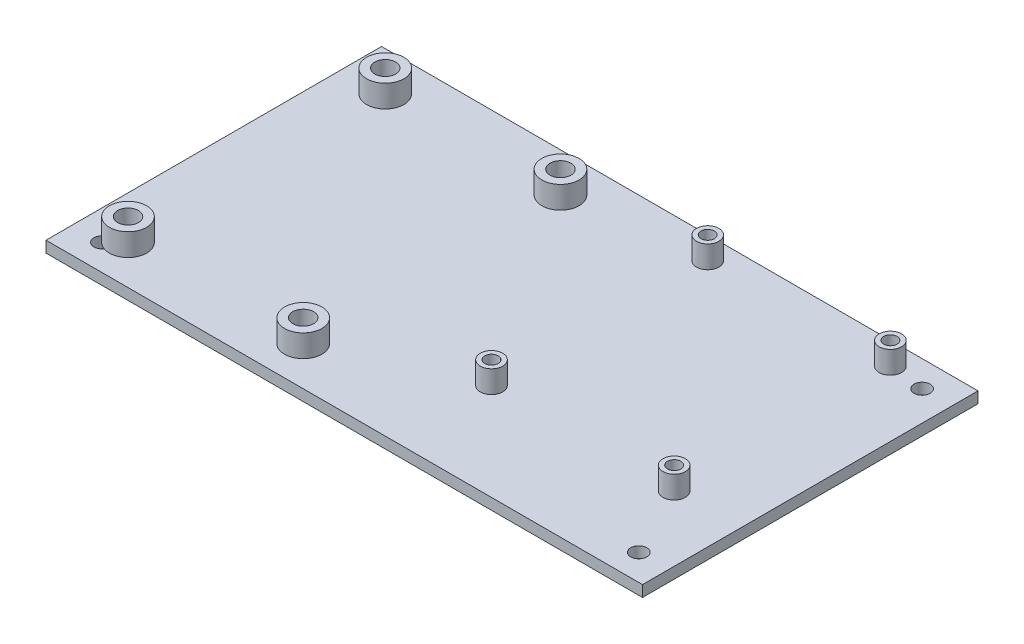
ISO-10303-21;
HEADER;
FILE_DESCRIPTION(('STEP AP214'),'2;1');
FILE_NAME('part.step','',(''),(''),'','','');
FILE_SCHEMA(('AUTOMOTIVE_DESIGN { 1 0 10303 214 1 1 1 1 }'));
ENDSEC;
DATA;
#1=APPLICATION_CONTEXT('core data for automotive mechanical design processes');
#2=APPLICATION_PROTOCOL_DEFINITION('international standard','automotive_design',2000,#1);
#3=PRODUCT_CONTEXT('',#1,'mechanical');
#4=PRODUCT('Part','Part','',(#3));
#5=PRODUCT_RELATED_PRODUCT_CATEGORY('part','',(#4));
#6=PRODUCT_DEFINITION_FORMATION('','',#4);
#7=PRODUCT_DEFINITION_CONTEXT('part definition',#1,'design');
#8=PRODUCT_DEFINITION('design','',#6,#7);
#9=PRODUCT_DEFINITION_SHAPE('','',#8);
#10=(LENGTH_UNIT() NAMED_UNIT(*) SI_UNIT(.MILLI.,.METRE.));
#11=(NAMED_UNIT(*) PLANE_ANGLE_UNIT() SI_UNIT($,.RADIAN.));
#12=(NAMED_UNIT(*) SI_UNIT($,.STERADIAN.) SOLID_ANGLE_UNIT());
#13=UNCERTAINTY_MEASURE_WITH_UNIT(LENGTH_MEASURE(1.E-05),#10,'distance_accuracy_value','');
#14=(GEOMETRIC_REPRESENTATION_CONTEXT(3) GLOBAL_UNCERTAINTY_ASSIGNED_CONTEXT((#13)) GLOBAL_UNIT_ASSIGNED_CONTEXT((#10,
#11,#12)) REPRESENTATION_CONTEXT('',''));
#15=CARTESIAN_POINT('',(0.,0.,0.));
#16=DIRECTION('',(0.,0.,1.));
#17=DIRECTION('',(1.,0.,0.));
#18=AXIS2_PLACEMENT_3D('',#15,#16,#17);
#19=CARTESIAN_POINT('',(0.,3.,0.));
#20=DIRECTION('',(0.,1.,0.));
#21=DIRECTION('',(0.,0.,1.));
#22=AXIS2_PLACEMENT_3D('',#19,#20,#21);
#23=PLANE('',#22);
#24=CARTESIAN_POINT('',(-72.,3.,-38.));
#25=DIRECTION('',(0.,1.,0.));
#26=DIRECTION('',(0.,0.,1.));
#27=AXIS2_PLACEMENT_3D('',#24,#25,#26);
#28=CIRCLE('',#27,2.15);
#29=CARTESIAN_POINT('',(-70.2140462626171,3.,-39.1970251659543));
#30=VERTEX_POINT('',#29);
#31=CARTESIAN_POINT('',(-73.1970251659543,3.,-36.2140462626171));
#32=VERTEX_POINT('',#31);
#33=EDGE_CURVE('E116',#30,#32,#28,.T.);
#34=ORIENTED_EDGE('',*,*,#33,.F.);
#35=CARTESIAN_POINT('',(-68.5,3.,-34.5));
#36=DIRECTION('',(0.,1.,0.));
#37=DIRECTION('',(0.,0.,1.));
#38=AXIS2_PLACEMENT_3D('',#35,#36,#37);
#39=CIRCLE('',#38,5.);
#40=EDGE_CURVE('E181',#32,#30,#39,.T.);
#41=ORIENTED_EDGE('',*,*,#40,.F.);
#42=EDGE_LOOP('',(#34,#41));
#43=FACE_BOUND('',#42,.T.);
#44=CARTESIAN_POINT('',(72.,3.,-38.));
#45=DIRECTION('',(0.,1.,0.));
#46=DIRECTION('',(0.,0.,1.));
#47=AXIS2_PLACEMENT_3D('',#44,#45,#46);
#48=CIRCLE('',#47,2.15);
#49=CARTESIAN_POINT('',(72.,3.,-35.85));
#50=VERTEX_POINT('',#49);
#51=EDGE_CURVE('E295',#50,#50,#48,.T.);
#52=ORIENTED_EDGE('',*,*,#51,.F.);
#53=EDGE_LOOP('',(#52));
#54=FACE_BOUND('',#53,.T.);
#55=CARTESIAN_POINT('',(72.,3.,38.));
#56=DIRECTION('',(0.,1.,0.));
#57=DIRECTION('',(0.,0.,1.));
#58=AXIS2_PLACEMENT_3D('',#55,#56,#57);
#59=CIRCLE('',#58,2.15);
#60=CARTESIAN_POINT('',(72.,3.,40.15));
#61=VERTEX_POINT('',#60);
#62=EDGE_CURVE('E130',#61,#61,#59,.T.);
#63=ORIENTED_EDGE('',*,*,#62,.F.);
#64=EDGE_LOOP('',(#63));
#65=FACE_BOUND('',#64,.T.);
#66=CARTESIAN_POINT('',(-21.5,3.,34.5));
#67=DIRECTION('',(0.,1.,0.));
#68=DIRECTION('',(0.,0.,1.));
#69=AXIS2_PLACEMENT_3D('',#66,#67,#68);
#70=CIRCLE('',#69,5.);
#71=CARTESIAN_POINT('',(-21.5,3.,39.5));
#72=VERTEX_POINT('',#71);
#73=EDGE_CURVE('E11',#72,#72,#70,.T.);
#74=ORIENTED_EDGE('',*,*,#73,.F.);
#75=EDGE_LOOP('',(#74));
#76=FACE_BOUND('',#75,.T.);
#77=CARTESIAN_POINT('',(13.5,3.,19.));
#78=DIRECTION('',(0.,1.,0.));
#79=DIRECTION('',(0.,0.,1.));
#80=AXIS2_PLACEMENT_3D('',#77,#78,#79);
#81=CIRCLE('',#80,3.);
#82=CARTESIAN_POINT('',(13.5,3.,22.));
#83=VERTEX_POINT('',#82);
#84=EDGE_CURVE('E48',#83,#83,#81,.T.);
#85=ORIENTED_EDGE('',*,*,#84,.F.);
#86=EDGE_LOOP('',(#85));
#87=FACE_BOUND('',#86,.T.);
#88=CARTESIAN_POINT('',(62.5,3.,19.));
#89=DIRECTION('',(0.,1.,0.));
#90=DIRECTION('',(0.,0.,1.));
#91=AXIS2_PLACEMENT_3D('',#88,#89,#90);
#92=CIRCLE('',#91,3.);
#93=CARTESIAN_POINT('',(62.5,3.,22.));
#94=VERTEX_POINT('',#93);
#95=EDGE_CURVE('E200',#94,#94,#92,.T.);
#96=ORIENTED_EDGE('',*,*,#95,.F.);
#97=EDGE_LOOP('',(#96));
#98=FACE_BOUND('',#97,.T.);
#99=CARTESIAN_POINT('',(13.5,3.,-39.));
#100=DIRECTION('',(0.,1.,0.));
#101=DIRECTION('',(0.,0.,1.));
#102=AXIS2_PLACEMENT_3D('',#99,#100,#101);
#103=CIRCLE('',#102,3.);
#104=CARTESIAN_POINT('',(13.5,3.,-36.));
#105=VERTEX_POINT('',#104);
#106=EDGE_CURVE('E179',#105,#105,#103,.T.);
#107=ORIENTED_EDGE('',*,*,#106,.F.);
#108=EDGE_LOOP('',(#107));
#109=FACE_BOUND('',#108,.T.);
#110=CARTESIAN_POINT('',(-21.5,3.,-34.5));
#111=DIRECTION('',(0.,1.,0.));
#112=DIRECTION('',(0.,0.,1.));
#113=AXIS2_PLACEMENT_3D('',#110,#111,#112);
#114=CIRCLE('',#113,5.);
#115=CARTESIAN_POINT('',(-21.5,3.,-29.5));
#116=VERTEX_POINT('',#115);
#117=EDGE_CURVE('E189',#116,#116,#114,.T.);
#118=ORIENTED_EDGE('',*,*,#117,.F.);
#119=EDGE_LOOP('',(#118));
#120=FACE_BOUND('',#119,.T.);
#121=CARTESIAN_POINT('',(62.5,3.,-39.));
#122=DIRECTION('',(0.,1.,0.));
#123=DIRECTION('',(0.,0.,1.));
#124=AXIS2_PLACEMENT_3D('',#121,#122,#123);
#125=CIRCLE('',#124,3.);
#126=CARTESIAN_POINT('',(62.5,3.,-36.));
#127=VERTEX_POINT('',#126);
#128=EDGE_CURVE('E220',#127,#127,#125,.T.);
#129=ORIENTED_EDGE('',*,*,#128,.F.);
#130=EDGE_LOOP('',(#129));
#131=FACE_BOUND('',#130,.T.);
#132=DIRECTION('',(0.,0.,1.));
#133=VECTOR('',#132,1.);
#134=CARTESIAN_POINT('',(-80.,3.,-45.));
#135=LINE('',#134,#133);
#136=CARTESIAN_POINT('',(-80.,3.,-45.));
#137=VERTEX_POINT('',#136);
#138=CARTESIAN_POINT('',(-80.,3.,45.));
#139=VERTEX_POINT('',#138);
#140=EDGE_CURVE('E223',#137,#139,#135,.T.);
#141=ORIENTED_EDGE('',*,*,#140,.T.);
#142=DIRECTION('',(1.,0.,0.));
#143=VECTOR('',#142,1.);
#144=CARTESIAN_POINT('',(-80.,3.,45.));
#145=LINE('',#144,#143);
#146=CARTESIAN_POINT('',(80.,3.,45.));
#147=VERTEX_POINT('',#146);
#148=EDGE_CURVE('E228',#139,#147,#145,.T.);
#149=ORIENTED_EDGE('',*,*,#148,.T.);
#150=DIRECTION('',(0.,0.,-1.));
#151=VECTOR('',#150,1.);
#152=CARTESIAN_POINT('',(80.,3.,-45.));
#153=LINE('',#152,#151);
#154=CARTESIAN_POINT('',(80.,3.,-45.));
#155=VERTEX_POINT('',#154);
#156=EDGE_CURVE('E230',#147,#155,#153,.T.);
#157=ORIENTED_EDGE('',*,*,#156,.T.);
#158=DIRECTION('',(-1.,0.,0.));
#159=VECTOR('',#158,1.);
#160=CARTESIAN_POINT('',(-80.,3.,-45.));
#161=LINE('',#160,#159);
#162=EDGE_CURVE('E233',#155,#137,#161,.T.);
#163=ORIENTED_EDGE('',*,*,#162,.T.);
#164=EDGE_LOOP('',(#141,#149,#157,#163));
#165=FACE_BOUND('',#164,.T.);
#166=CARTESIAN_POINT('',(-72.,3.,38.));
#167=DIRECTION('',(0.,1.,0.));
#168=DIRECTION('',(0.,0.,1.));
#169=AXIS2_PLACEMENT_3D('',#166,#167,#168);
#170=CIRCLE('',#169,2.15);
#171=CARTESIAN_POINT('',(-73.1970251659543,3.,36.2140462626171));
#172=VERTEX_POINT('',#171);
#173=CARTESIAN_POINT('',(-70.2140462626171,3.,39.1970251659544));
#174=VERTEX_POINT('',#173);
#175=EDGE_CURVE('E274',#172,#174,#170,.T.);
#176=ORIENTED_EDGE('',*,*,#175,.F.);
#177=CARTESIAN_POINT('',(-68.5,3.,34.5));
#178=DIRECTION('',(0.,1.,0.));
#179=DIRECTION('',(0.,0.,1.));
#180=AXIS2_PLACEMENT_3D('',#177,#178,#179);
#181=CIRCLE('',#180,5.);
#182=EDGE_CURVE('E186',#174,#172,#181,.T.);
#183=ORIENTED_EDGE('',*,*,#182,.F.);
#184=EDGE_LOOP('',(#176,#183));
#185=FACE_BOUND('',#184,.T.);
#186=ADVANCED_FACE('F39',(#43,#54,#65,#76,#87,#98,#109,#120,#131,#165,#185),#23,.T.);
#187=CARTESIAN_POINT('',(-80.,3.,-45.));
#188=DIRECTION('',(1.,0.,0.));
#189=DIRECTION('',(0.,0.,-1.));
#190=AXIS2_PLACEMENT_3D('',#187,#188,#189);
#191=PLANE('',#190);
#192=DIRECTION('',(0.,0.,1.));
#193=VECTOR('',#192,1.);
#194=CARTESIAN_POINT('',(-80.,0.,-45.));
#195=LINE('',#194,#193);
#196=CARTESIAN_POINT('',(-80.,0.,-45.));
#197=VERTEX_POINT('',#196);
#198=CARTESIAN_POINT('',(-80.,0.,45.));
#199=VERTEX_POINT('',#198);
#200=EDGE_CURVE('E218',#197,#199,#195,.T.);
#201=ORIENTED_EDGE('',*,*,#200,.T.);
#202=DIRECTION('',(0.,-1.,0.));
#203=VECTOR('',#202,1.);
#204=CARTESIAN_POINT('',(-80.,3.,45.));
#205=LINE('',#204,#203);
#206=EDGE_CURVE('E43',#139,#199,#205,.T.);
#207=ORIENTED_EDGE('',*,*,#206,.F.);
#208=ORIENTED_EDGE('',*,*,#140,.F.);
#209=DIRECTION('',(0.,-1.,0.));
#210=VECTOR('',#209,1.);
#211=CARTESIAN_POINT('',(-80.,3.,-45.));
#212=LINE('',#211,#210);
#213=EDGE_CURVE('E231',#137,#197,#212,.T.);
#214=ORIENTED_EDGE('',*,*,#213,.T.);
#215=EDGE_LOOP('',(#201,#207,#208,#214));
#216=FACE_BOUND('',#215,.T.);
#217=ADVANCED_FACE('F41',(#216),#191,.F.);
#218=CARTESIAN_POINT('',(-80.,3.,45.));
#219=DIRECTION('',(0.,0.,-1.));
#220=DIRECTION('',(-1.,0.,0.));
#221=AXIS2_PLACEMENT_3D('',#218,#219,#220);
#222=PLANE('',#221);
#223=DIRECTION('',(1.,0.,0.));
#224=VECTOR('',#223,1.);
#225=CARTESIAN_POINT('',(-80.,0.,45.));
#226=LINE('',#225,#224);
#227=CARTESIAN_POINT('',(80.,0.,45.));
#228=VERTEX_POINT('',#227);
#229=EDGE_CURVE('E236',#199,#228,#226,.T.);
#230=ORIENTED_EDGE('',*,*,#229,.T.);
#231=DIRECTION('',(0.,-1.,0.));
#232=VECTOR('',#231,1.);
#233=CARTESIAN_POINT('',(80.,3.,45.));
#234=LINE('',#233,#232);
#235=EDGE_CURVE('E244',#147,#228,#234,.T.);
#236=ORIENTED_EDGE('',*,*,#235,.F.);
#237=ORIENTED_EDGE('',*,*,#148,.F.);
#238=ORIENTED_EDGE('',*,*,#206,.T.);
#239=EDGE_LOOP('',(#230,#236,#237,#238));
#240=FACE_BOUND('',#239,.T.);
#241=ADVANCED_FACE('F251',(#240),#222,.F.);
#242=CARTESIAN_POINT('',(80.,3.,-45.));
#243=DIRECTION('',(-1.,0.,0.));
#244=DIRECTION('',(0.,0.,1.));
#245=AXIS2_PLACEMENT_3D('',#242,#243,#244);
#246=PLANE('',#245);
#247=DIRECTION('',(0.,0.,-1.));
#248=VECTOR('',#247,1.);
#249=CARTESIAN_POINT('',(80.,0.,-45.));
#250=LINE('',#249,#248);
#251=CARTESIAN_POINT('',(80.,0.,-45.));
#252=VERTEX_POINT('',#251);
#253=EDGE_CURVE('E238',#228,#252,#250,.T.);
#254=ORIENTED_EDGE('',*,*,#253,.T.);
#255=DIRECTION('',(0.,-1.,0.));
#256=VECTOR('',#255,1.);
#257=CARTESIAN_POINT('',(80.,3.,-45.));
#258=LINE('',#257,#256);
#259=EDGE_CURVE('E243',#155,#252,#258,.T.);
#260=ORIENTED_EDGE('',*,*,#259,.F.);
#261=ORIENTED_EDGE('',*,*,#156,.F.);
#262=ORIENTED_EDGE('',*,*,#235,.T.);
#263=EDGE_LOOP('',(#254,#260,#261,#262));
#264=FACE_BOUND('',#263,.T.);
#265=ADVANCED_FACE('F264',(#264),#246,.F.);
#266=CARTESIAN_POINT('',(-80.,3.,-45.));
#267=DIRECTION('',(0.,0.,1.));
#268=DIRECTION('',(1.,0.,0.));
#269=AXIS2_PLACEMENT_3D('',#266,#267,#268);
#270=PLANE('',#269);
#271=DIRECTION('',(-1.,0.,0.));
#272=VECTOR('',#271,1.);
#273=CARTESIAN_POINT('',(-80.,0.,-45.));
#274=LINE('',#273,#272);
#275=EDGE_CURVE('E227',#252,#197,#274,.T.);
#276=ORIENTED_EDGE('',*,*,#275,.T.);
#277=ORIENTED_EDGE('',*,*,#213,.F.);
#278=ORIENTED_EDGE('',*,*,#162,.F.);
#279=ORIENTED_EDGE('',*,*,#259,.T.);
#280=EDGE_LOOP('',(#276,#277,#278,#279));
#281=FACE_BOUND('',#280,.T.);
#282=ADVANCED_FACE('F266',(#281),#270,.F.);
#283=CARTESIAN_POINT('',(0.,0.,0.));
#284=DIRECTION('',(0.,1.,0.));
#285=DIRECTION('',(0.,0.,1.));
#286=AXIS2_PLACEMENT_3D('',#283,#284,#285);
#287=PLANE('',#286);
#288=CARTESIAN_POINT('',(-72.,0.,38.));
#289=DIRECTION('',(0.,1.,0.));
#290=DIRECTION('',(0.,0.,1.));
#291=AXIS2_PLACEMENT_3D('',#288,#289,#290);
#292=CIRCLE('',#291,2.15);
#293=CARTESIAN_POINT('',(-72.,0.,40.15));
#294=VERTEX_POINT('',#293);
#295=EDGE_CURVE('E286',#294,#294,#292,.T.);
#296=ORIENTED_EDGE('',*,*,#295,.T.);
#297=EDGE_LOOP('',(#296));
#298=FACE_BOUND('',#297,.T.);
#299=CARTESIAN_POINT('',(72.,0.,-38.));
#300=DIRECTION('',(0.,1.,0.));
#301=DIRECTION('',(0.,0.,1.));
#302=AXIS2_PLACEMENT_3D('',#299,#300,#301);
#303=CIRCLE('',#302,2.15);
#304=CARTESIAN_POINT('',(72.,0.,-35.85));
#305=VERTEX_POINT('',#304);
#306=EDGE_CURVE('E280',#305,#305,#303,.T.);
#307=ORIENTED_EDGE('',*,*,#306,.T.);
#308=EDGE_LOOP('',(#307));
#309=FACE_BOUND('',#308,.T.);
#310=CARTESIAN_POINT('',(-72.,0.,-38.));
#311=DIRECTION('',(0.,1.,0.));
#312=DIRECTION('',(0.,0.,1.));
#313=AXIS2_PLACEMENT_3D('',#310,#311,#312);
#314=CIRCLE('',#313,2.15);
#315=CARTESIAN_POINT('',(-72.,0.,-35.85));
#316=VERTEX_POINT('',#315);
#317=EDGE_CURVE('E124',#316,#316,#314,.T.);
#318=ORIENTED_EDGE('',*,*,#317,.T.);
#319=EDGE_LOOP('',(#318));
#320=FACE_BOUND('',#319,.T.);
#321=CARTESIAN_POINT('',(72.,0.,38.));
#322=DIRECTION('',(0.,1.,0.));
#323=DIRECTION('',(0.,0.,1.));
#324=AXIS2_PLACEMENT_3D('',#321,#322,#323);
#325=CIRCLE('',#324,2.15);
#326=CARTESIAN_POINT('',(72.,0.,40.15));
#327=VERTEX_POINT('',#326);
#328=EDGE_CURVE('E287',#327,#327,#325,.T.);
#329=ORIENTED_EDGE('',*,*,#328,.T.);
#330=EDGE_LOOP('',(#329));
#331=FACE_BOUND('',#330,.T.);
#332=ORIENTED_EDGE('',*,*,#200,.F.);
#333=ORIENTED_EDGE('',*,*,#275,.F.);
#334=ORIENTED_EDGE('',*,*,#253,.F.);
#335=ORIENTED_EDGE('',*,*,#229,.F.);
#336=EDGE_LOOP('',(#332,#333,#334,#335));
#337=FACE_BOUND('',#336,.T.);
#338=ADVANCED_FACE('F261',(#298,#309,#320,#331,#337),#287,.F.);
#339=CARTESIAN_POINT('',(62.5,9.,-39.));
#340=DIRECTION('',(0.,-1.,0.));
#341=DIRECTION('',(0.,0.,-1.));
#342=AXIS2_PLACEMENT_3D('',#339,#340,#341);
#343=CYLINDRICAL_SURFACE('',#342,3.);
#344=CARTESIAN_POINT('',(62.5,9.,-39.));
#345=DIRECTION('',(0.,1.,0.));
#346=DIRECTION('',(0.,0.,1.));
#347=AXIS2_PLACEMENT_3D('',#344,#345,#346);
#348=CIRCLE('',#347,3.);
#349=CARTESIAN_POINT('',(62.5,9.,-36.));
#350=VERTEX_POINT('',#349);
#351=EDGE_CURVE('E215',#350,#350,#348,.T.);
#352=ORIENTED_EDGE('',*,*,#351,.F.);
#353=EDGE_LOOP('',(#352));
#354=FACE_BOUND('',#353,.T.);
#355=ORIENTED_EDGE('',*,*,#128,.T.);
#356=EDGE_LOOP('',(#355));
#357=FACE_BOUND('',#356,.T.);
#358=ADVANCED_FACE('F435',(#354,#357),#343,.T.);
#359=CARTESIAN_POINT('',(62.5,9.,-39.));
#360=DIRECTION('',(0.,1.,0.));
#361=DIRECTION('',(0.,0.,1.));
#362=AXIS2_PLACEMENT_3D('',#359,#360,#361);
#363=PLANE('',#362);
#364=CARTESIAN_POINT('',(62.5,9.,-39.));
#365=DIRECTION('',(0.,1.,0.));
#366=DIRECTION('',(0.,0.,1.));
#367=AXIS2_PLACEMENT_3D('',#364,#365,#366);
#368=CIRCLE('',#367,1.8);
#369=CARTESIAN_POINT('',(62.5,9.,-37.2));
#370=VERTEX_POINT('',#369);
#371=EDGE_CURVE('E165',#370,#370,#368,.T.);
#372=ORIENTED_EDGE('',*,*,#371,.F.);
#373=EDGE_LOOP('',(#372));
#374=FACE_BOUND('',#373,.T.);
#375=ORIENTED_EDGE('',*,*,#351,.T.);
#376=EDGE_LOOP('',(#375));
#377=FACE_BOUND('',#376,.T.);
#378=ADVANCED_FACE('F389',(#374,#377),#363,.T.);
#379=CARTESIAN_POINT('',(-68.5,9.,34.5));
#380=DIRECTION('',(0.,-1.,0.));
#381=DIRECTION('',(0.,0.,-1.));
#382=AXIS2_PLACEMENT_3D('',#379,#380,#381);
#383=CYLINDRICAL_SURFACE('',#382,5.);
#384=CARTESIAN_POINT('',(-68.5,9.,34.5));
#385=DIRECTION('',(0.,1.,0.));
#386=DIRECTION('',(0.,0.,1.));
#387=AXIS2_PLACEMENT_3D('',#384,#385,#386);
#388=CIRCLE('',#387,5.);
#389=CARTESIAN_POINT('',(-68.5,9.,39.5));
#390=VERTEX_POINT('',#389);
#391=EDGE_CURVE('E188',#390,#390,#388,.T.);
#392=ORIENTED_EDGE('',*,*,#391,.F.);
#393=EDGE_LOOP('',(#392));
#394=FACE_BOUND('',#393,.T.);
#395=EDGE_CURVE('E184',#172,#174,#181,.T.);
#396=ORIENTED_EDGE('',*,*,#395,.T.);
#397=ORIENTED_EDGE('',*,*,#182,.T.);
#398=EDGE_LOOP('',(#396,#397));
#399=FACE_BOUND('',#398,.T.);
#400=ADVANCED_FACE('F278',(#394,#399),#383,.T.);
#401=CARTESIAN_POINT('',(-68.5,9.,34.5));
#402=DIRECTION('',(0.,1.,0.));
#403=DIRECTION('',(0.,0.,1.));
#404=AXIS2_PLACEMENT_3D('',#401,#402,#403);
#405=PLANE('',#404);
#406=CARTESIAN_POINT('',(-68.5,9.,34.5));
#407=DIRECTION('',(0.,1.,0.));
#408=DIRECTION('',(0.,0.,1.));
#409=AXIS2_PLACEMENT_3D('',#406,#407,#408);
#410=CIRCLE('',#409,2.8);
#411=CARTESIAN_POINT('',(-68.5,9.,37.3));
#412=VERTEX_POINT('',#411);
#413=EDGE_CURVE('E140',#412,#412,#410,.T.);
#414=ORIENTED_EDGE('',*,*,#413,.F.);
#415=EDGE_LOOP('',(#414));
#416=FACE_BOUND('',#415,.T.);
#417=ORIENTED_EDGE('',*,*,#391,.T.);
#418=EDGE_LOOP('',(#417));
#419=FACE_BOUND('',#418,.T.);
#420=ADVANCED_FACE('F390',(#416,#419),#405,.T.);
#421=CARTESIAN_POINT('',(-21.5,9.,-34.5));
#422=DIRECTION('',(0.,-1.,0.));
#423=DIRECTION('',(0.,0.,-1.));
#424=AXIS2_PLACEMENT_3D('',#421,#422,#423);
#425=CYLINDRICAL_SURFACE('',#424,5.);
#426=CARTESIAN_POINT('',(-21.5,9.,-34.5));
#427=DIRECTION('',(0.,1.,0.));
#428=DIRECTION('',(0.,0.,1.));
#429=AXIS2_PLACEMENT_3D('',#426,#427,#428);
#430=CIRCLE('',#429,5.);
#431=CARTESIAN_POINT('',(-21.5,9.,-29.5));
#432=VERTEX_POINT('',#431);
#433=EDGE_CURVE('E183',#432,#432,#430,.T.);
#434=ORIENTED_EDGE('',*,*,#433,.F.);
#435=EDGE_LOOP('',(#434));
#436=FACE_BOUND('',#435,.T.);
#437=ORIENTED_EDGE('',*,*,#117,.T.);
#438=EDGE_LOOP('',(#437));
#439=FACE_BOUND('',#438,.T.);
#440=ADVANCED_FACE('F392',(#436,#439),#425,.T.);
#441=CARTESIAN_POINT('',(-21.5,9.,-34.5));
#442=DIRECTION('',(0.,1.,0.));
#443=DIRECTION('',(0.,0.,1.));
#444=AXIS2_PLACEMENT_3D('',#441,#442,#443);
#445=PLANE('',#444);
#446=CARTESIAN_POINT('',(-21.5,9.,-34.5));
#447=DIRECTION('',(0.,1.,0.));
#448=DIRECTION('',(0.,0.,1.));
#449=AXIS2_PLACEMENT_3D('',#446,#447,#448);
#450=CIRCLE('',#449,2.8);
#451=CARTESIAN_POINT('',(-21.5,9.,-31.7));
#452=VERTEX_POINT('',#451);
#453=EDGE_CURVE('E144',#452,#452,#450,.T.);
#454=ORIENTED_EDGE('',*,*,#453,.F.);
#455=EDGE_LOOP('',(#454));
#456=FACE_BOUND('',#455,.T.);
#457=ORIENTED_EDGE('',*,*,#433,.T.);
#458=EDGE_LOOP('',(#457));
#459=FACE_BOUND('',#458,.T.);
#460=ADVANCED_FACE('F378',(#456,#459),#445,.T.);
#461=CARTESIAN_POINT('',(-68.5,9.,-34.5));
#462=DIRECTION('',(0.,-1.,0.));
#463=DIRECTION('',(0.,0.,-1.));
#464=AXIS2_PLACEMENT_3D('',#461,#462,#463);
#465=CYLINDRICAL_SURFACE('',#464,5.);
#466=CARTESIAN_POINT('',(-68.5,9.,-34.5));
#467=DIRECTION('',(0.,1.,0.));
#468=DIRECTION('',(0.,0.,1.));
#469=AXIS2_PLACEMENT_3D('',#466,#467,#468);
#470=CIRCLE('',#469,5.);
#471=CARTESIAN_POINT('',(-68.5,9.,-29.5));
#472=VERTEX_POINT('',#471);
#473=EDGE_CURVE('E176',#472,#472,#470,.T.);
#474=ORIENTED_EDGE('',*,*,#473,.F.);
#475=EDGE_LOOP('',(#474));
#476=FACE_BOUND('',#475,.T.);
#477=EDGE_CURVE('E113',#30,#32,#39,.T.);
#478=ORIENTED_EDGE('',*,*,#477,.T.);
#479=ORIENTED_EDGE('',*,*,#40,.T.);
#480=EDGE_LOOP('',(#478,#479));
#481=FACE_BOUND('',#480,.T.);
#482=ADVANCED_FACE('F374',(#476,#481),#465,.T.);
#483=CARTESIAN_POINT('',(-68.5,9.,-34.5));
#484=DIRECTION('',(0.,1.,0.));
#485=DIRECTION('',(0.,0.,1.));
#486=AXIS2_PLACEMENT_3D('',#483,#484,#485);
#487=PLANE('',#486);
#488=CARTESIAN_POINT('',(-68.5,9.,-34.5));
#489=DIRECTION('',(0.,1.,0.));
#490=DIRECTION('',(0.,0.,1.));
#491=AXIS2_PLACEMENT_3D('',#488,#489,#490);
#492=CIRCLE('',#491,2.8);
#493=CARTESIAN_POINT('',(-68.5,9.,-31.7));
#494=VERTEX_POINT('',#493);
#495=EDGE_CURVE('E131',#494,#494,#492,.T.);
#496=ORIENTED_EDGE('',*,*,#495,.F.);
#497=EDGE_LOOP('',(#496));
#498=FACE_BOUND('',#497,.T.);
#499=ORIENTED_EDGE('',*,*,#473,.T.);
#500=EDGE_LOOP('',(#499));
#501=FACE_BOUND('',#500,.T.);
#502=ADVANCED_FACE('F377',(#498,#501),#487,.T.);
#503=CARTESIAN_POINT('',(13.5,9.,-39.));
#504=DIRECTION('',(0.,-1.,0.));
#505=DIRECTION('',(0.,0.,-1.));
#506=AXIS2_PLACEMENT_3D('',#503,#504,#505);
#507=CYLINDRICAL_SURFACE('',#506,3.);
#508=CARTESIAN_POINT('',(13.5,9.,-39.));
#509=DIRECTION('',(0.,1.,0.));
#510=DIRECTION('',(0.,0.,1.));
#511=AXIS2_PLACEMENT_3D('',#508,#509,#510);
#512=CIRCLE('',#511,3.);
#513=CARTESIAN_POINT('',(13.5,9.,-36.));
#514=VERTEX_POINT('',#513);
#515=EDGE_CURVE('E209',#514,#514,#512,.T.);
#516=ORIENTED_EDGE('',*,*,#515,.F.);
#517=EDGE_LOOP('',(#516));
#518=FACE_BOUND('',#517,.T.);
#519=ORIENTED_EDGE('',*,*,#106,.T.);
#520=EDGE_LOOP('',(#519));
#521=FACE_BOUND('',#520,.T.);
#522=ADVANCED_FACE('F384',(#518,#521),#507,.T.);
#523=CARTESIAN_POINT('',(13.5,9.,-39.));
#524=DIRECTION('',(0.,1.,0.));
#525=DIRECTION('',(0.,0.,1.));
#526=AXIS2_PLACEMENT_3D('',#523,#524,#525);
#527=PLANE('',#526);
#528=CARTESIAN_POINT('',(13.5,9.,-39.));
#529=DIRECTION('',(0.,1.,0.));
#530=DIRECTION('',(0.,0.,1.));
#531=AXIS2_PLACEMENT_3D('',#528,#529,#530);
#532=CIRCLE('',#531,1.8);
#533=CARTESIAN_POINT('',(13.5,9.,-37.2));
#534=VERTEX_POINT('',#533);
#535=EDGE_CURVE('E163',#534,#534,#532,.T.);
#536=ORIENTED_EDGE('',*,*,#535,.F.);
#537=EDGE_LOOP('',(#536));
#538=FACE_BOUND('',#537,.T.);
#539=ORIENTED_EDGE('',*,*,#515,.T.);
#540=EDGE_LOOP('',(#539));
#541=FACE_BOUND('',#540,.T.);
#542=ADVANCED_FACE('F418',(#538,#541),#527,.T.);
#543=CARTESIAN_POINT('',(62.5,9.,19.));
#544=DIRECTION('',(0.,-1.,0.));
#545=DIRECTION('',(0.,0.,-1.));
#546=AXIS2_PLACEMENT_3D('',#543,#544,#545);
#547=CYLINDRICAL_SURFACE('',#546,3.);
#548=CARTESIAN_POINT('',(62.5,9.,19.));
#549=DIRECTION('',(0.,1.,0.));
#550=DIRECTION('',(0.,0.,1.));
#551=AXIS2_PLACEMENT_3D('',#548,#549,#550);
#552=CIRCLE('',#551,3.);
#553=CARTESIAN_POINT('',(62.5,9.,22.));
#554=VERTEX_POINT('',#553);
#555=EDGE_CURVE('E203',#554,#554,#552,.T.);
#556=ORIENTED_EDGE('',*,*,#555,.F.);
#557=EDGE_LOOP('',(#556));
#558=FACE_BOUND('',#557,.T.);
#559=ORIENTED_EDGE('',*,*,#95,.T.);
#560=EDGE_LOOP('',(#559));
#561=FACE_BOUND('',#560,.T.);
#562=ADVANCED_FACE('F422',(#558,#561),#547,.T.);
#563=CARTESIAN_POINT('',(62.5,9.,19.));
#564=DIRECTION('',(0.,1.,0.));
#565=DIRECTION('',(0.,0.,1.));
#566=AXIS2_PLACEMENT_3D('',#563,#564,#565);
#567=PLANE('',#566);
#568=CARTESIAN_POINT('',(62.5,9.,19.));
#569=DIRECTION('',(0.,1.,0.));
#570=DIRECTION('',(0.,0.,1.));
#571=AXIS2_PLACEMENT_3D('',#568,#569,#570);
#572=CIRCLE('',#571,1.8);
#573=CARTESIAN_POINT('',(62.5,9.,20.8));
#574=VERTEX_POINT('',#573);
#575=EDGE_CURVE('E166',#574,#574,#572,.T.);
#576=ORIENTED_EDGE('',*,*,#575,.F.);
#577=EDGE_LOOP('',(#576));
#578=FACE_BOUND('',#577,.T.);
#579=ORIENTED_EDGE('',*,*,#555,.T.);
#580=EDGE_LOOP('',(#579));
#581=FACE_BOUND('',#580,.T.);
#582=ADVANCED_FACE('F404',(#578,#581),#567,.T.);
#583=CARTESIAN_POINT('',(13.5,9.,19.));
#584=DIRECTION('',(0.,-1.,0.));
#585=DIRECTION('',(0.,0.,-1.));
#586=AXIS2_PLACEMENT_3D('',#583,#584,#585);
#587=CYLINDRICAL_SURFACE('',#586,3.);
#588=CARTESIAN_POINT('',(13.5,9.,19.));
#589=DIRECTION('',(0.,1.,0.));
#590=DIRECTION('',(0.,0.,1.));
#591=AXIS2_PLACEMENT_3D('',#588,#589,#590);
#592=CIRCLE('',#591,3.);
#593=CARTESIAN_POINT('',(13.5,9.,22.));
#594=VERTEX_POINT('',#593);
#595=EDGE_CURVE('E201',#594,#594,#592,.T.);
#596=ORIENTED_EDGE('',*,*,#595,.F.);
#597=EDGE_LOOP('',(#596));
#598=FACE_BOUND('',#597,.T.);
#599=ORIENTED_EDGE('',*,*,#84,.T.);
#600=EDGE_LOOP('',(#599));
#601=FACE_BOUND('',#600,.T.);
#602=ADVANCED_FACE('F399',(#598,#601),#587,.T.);
#603=CARTESIAN_POINT('',(13.5,9.,19.));
#604=DIRECTION('',(0.,1.,0.));
#605=DIRECTION('',(0.,0.,1.));
#606=AXIS2_PLACEMENT_3D('',#603,#604,#605);
#607=PLANE('',#606);
#608=CARTESIAN_POINT('',(13.5,9.,19.));
#609=DIRECTION('',(0.,1.,0.));
#610=DIRECTION('',(0.,0.,1.));
#611=AXIS2_PLACEMENT_3D('',#608,#609,#610);
#612=CIRCLE('',#611,1.8);
#613=CARTESIAN_POINT('',(13.5,9.,20.8));
#614=VERTEX_POINT('',#613);
#615=EDGE_CURVE('E146',#614,#614,#612,.T.);
#616=ORIENTED_EDGE('',*,*,#615,.F.);
#617=EDGE_LOOP('',(#616));
#618=FACE_BOUND('',#617,.T.);
#619=ORIENTED_EDGE('',*,*,#595,.T.);
#620=EDGE_LOOP('',(#619));
#621=FACE_BOUND('',#620,.T.);
#622=ADVANCED_FACE('F401',(#618,#621),#607,.T.);
#623=CARTESIAN_POINT('',(-21.5,9.,34.5));
#624=DIRECTION('',(0.,-1.,0.));
#625=DIRECTION('',(0.,0.,-1.));
#626=AXIS2_PLACEMENT_3D('',#623,#624,#625);
#627=CYLINDRICAL_SURFACE('',#626,5.);
#628=CARTESIAN_POINT('',(-21.5,9.,34.5));
#629=DIRECTION('',(0.,1.,0.));
#630=DIRECTION('',(0.,0.,1.));
#631=AXIS2_PLACEMENT_3D('',#628,#629,#630);
#632=CIRCLE('',#631,5.);
#633=CARTESIAN_POINT('',(-21.5,9.,39.5));
#634=VERTEX_POINT('',#633);
#635=EDGE_CURVE('E194',#634,#634,#632,.T.);
#636=ORIENTED_EDGE('',*,*,#635,.F.);
#637=EDGE_LOOP('',(#636));
#638=FACE_BOUND('',#637,.T.);
#639=ORIENTED_EDGE('',*,*,#73,.T.);
#640=EDGE_LOOP('',(#639));
#641=FACE_BOUND('',#640,.T.);
#642=ADVANCED_FACE('F409',(#638,#641),#627,.T.);
#643=CARTESIAN_POINT('',(-21.5,9.,34.5));
#644=DIRECTION('',(0.,1.,0.));
#645=DIRECTION('',(0.,0.,1.));
#646=AXIS2_PLACEMENT_3D('',#643,#644,#645);
#647=PLANE('',#646);
#648=CARTESIAN_POINT('',(-21.5,9.,34.5));
#649=DIRECTION('',(0.,1.,0.));
#650=DIRECTION('',(0.,0.,1.));
#651=AXIS2_PLACEMENT_3D('',#648,#649,#650);
#652=CIRCLE('',#651,2.8);
#653=CARTESIAN_POINT('',(-21.5,9.,37.3));
#654=VERTEX_POINT('',#653);
#655=EDGE_CURVE('E156',#654,#654,#652,.T.);
#656=ORIENTED_EDGE('',*,*,#655,.F.);
#657=EDGE_LOOP('',(#656));
#658=FACE_BOUND('',#657,.T.);
#659=ORIENTED_EDGE('',*,*,#635,.T.);
#660=EDGE_LOOP('',(#659));
#661=FACE_BOUND('',#660,.T.);
#662=ADVANCED_FACE('F353',(#658,#661),#647,.T.);
#663=CARTESIAN_POINT('',(-21.5,3.,34.5));
#664=DIRECTION('',(0.,1.,0.));
#665=DIRECTION('',(0.,0.,1.));
#666=AXIS2_PLACEMENT_3D('',#663,#664,#665);
#667=CYLINDRICAL_SURFACE('',#666,2.8);
#668=CARTESIAN_POINT('',(-21.5,3.,34.5));
#669=DIRECTION('',(0.,1.,0.));
#670=DIRECTION('',(0.,0.,1.));
#671=AXIS2_PLACEMENT_3D('',#668,#669,#670);
#672=CIRCLE('',#671,2.8);
#673=CARTESIAN_POINT('',(-21.5,3.,37.3));
#674=VERTEX_POINT('',#673);
#675=EDGE_CURVE('E139',#674,#674,#672,.T.);
#676=ORIENTED_EDGE('',*,*,#675,.F.);
#677=EDGE_LOOP('',(#676));
#678=FACE_BOUND('',#677,.T.);
#679=ORIENTED_EDGE('',*,*,#655,.T.);
#680=EDGE_LOOP('',(#679));
#681=FACE_BOUND('',#680,.T.);
#682=ADVANCED_FACE('F350',(#678,#681),#667,.F.);
#683=CARTESIAN_POINT('',(-21.5,3.,34.5));
#684=DIRECTION('',(0.,1.,0.));
#685=DIRECTION('',(0.,0.,1.));
#686=AXIS2_PLACEMENT_3D('',#683,#684,#685);
#687=PLANE('',#686);
#688=ORIENTED_EDGE('',*,*,#675,.T.);
#689=EDGE_LOOP('',(#688));
#690=FACE_BOUND('',#689,.T.);
#691=ADVANCED_FACE('F341',(#690),#687,.T.);
#692=CARTESIAN_POINT('',(13.5,3.,19.));
#693=DIRECTION('',(0.,1.,0.));
#694=DIRECTION('',(0.,0.,1.));
#695=AXIS2_PLACEMENT_3D('',#692,#693,#694);
#696=CYLINDRICAL_SURFACE('',#695,1.8);
#697=CARTESIAN_POINT('',(13.5,3.,19.));
#698=DIRECTION('',(0.,1.,0.));
#699=DIRECTION('',(0.,0.,1.));
#700=AXIS2_PLACEMENT_3D('',#697,#698,#699);
#701=CIRCLE('',#700,1.8);
#702=CARTESIAN_POINT('',(13.5,3.,20.8));
#703=VERTEX_POINT('',#702);
#704=EDGE_CURVE('E154',#703,#703,#701,.T.);
#705=ORIENTED_EDGE('',*,*,#704,.F.);
#706=EDGE_LOOP('',(#705));
#707=FACE_BOUND('',#706,.T.);
#708=ORIENTED_EDGE('',*,*,#615,.T.);
#709=EDGE_LOOP('',(#708));
#710=FACE_BOUND('',#709,.T.);
#711=ADVANCED_FACE('F338',(#707,#710),#696,.F.);
#712=CARTESIAN_POINT('',(13.5,3.,19.));
#713=DIRECTION('',(0.,1.,0.));
#714=DIRECTION('',(0.,0.,1.));
#715=AXIS2_PLACEMENT_3D('',#712,#713,#714);
#716=PLANE('',#715);
#717=ORIENTED_EDGE('',*,*,#704,.T.);
#718=EDGE_LOOP('',(#717));
#719=FACE_BOUND('',#718,.T.);
#720=ADVANCED_FACE('F344',(#719),#716,.T.);
#721=CARTESIAN_POINT('',(62.5,3.,19.));
#722=DIRECTION('',(0.,1.,0.));
#723=DIRECTION('',(0.,0.,1.));
#724=AXIS2_PLACEMENT_3D('',#721,#722,#723);
#725=CYLINDRICAL_SURFACE('',#724,1.8);
#726=CARTESIAN_POINT('',(62.5,3.,19.));
#727=DIRECTION('',(0.,1.,0.));
#728=DIRECTION('',(0.,0.,1.));
#729=AXIS2_PLACEMENT_3D('',#726,#727,#728);
#730=CIRCLE('',#729,1.8);
#731=CARTESIAN_POINT('',(62.5,3.,20.8));
#732=VERTEX_POINT('',#731);
#733=EDGE_CURVE('E152',#732,#732,#730,.T.);
#734=ORIENTED_EDGE('',*,*,#733,.F.);
#735=EDGE_LOOP('',(#734));
#736=FACE_BOUND('',#735,.T.);
#737=ORIENTED_EDGE('',*,*,#575,.T.);
#738=EDGE_LOOP('',(#737));
#739=FACE_BOUND('',#738,.T.);
#740=ADVANCED_FACE('F349',(#736,#739),#725,.F.);
#741=CARTESIAN_POINT('',(62.5,3.,19.));
#742=DIRECTION('',(0.,1.,0.));
#743=DIRECTION('',(0.,0.,1.));
#744=AXIS2_PLACEMENT_3D('',#741,#742,#743);
#745=PLANE('',#744);
#746=ORIENTED_EDGE('',*,*,#733,.T.);
#747=EDGE_LOOP('',(#746));
#748=FACE_BOUND('',#747,.T.);
#749=ADVANCED_FACE('F363',(#748),#745,.T.);
#750=CARTESIAN_POINT('',(13.5,3.,-39.));
#751=DIRECTION('',(0.,1.,0.));
#752=DIRECTION('',(0.,0.,1.));
#753=AXIS2_PLACEMENT_3D('',#750,#751,#752);
#754=CYLINDRICAL_SURFACE('',#753,1.8);
#755=CARTESIAN_POINT('',(13.5,3.,-39.));
#756=DIRECTION('',(0.,1.,0.));
#757=DIRECTION('',(0.,0.,1.));
#758=AXIS2_PLACEMENT_3D('',#755,#756,#757);
#759=CIRCLE('',#758,1.8);
#760=CARTESIAN_POINT('',(13.5,3.,-37.2));
#761=VERTEX_POINT('',#760);
#762=EDGE_CURVE('E164',#761,#761,#759,.T.);
#763=ORIENTED_EDGE('',*,*,#762,.F.);
#764=EDGE_LOOP('',(#763));
#765=FACE_BOUND('',#764,.T.);
#766=ORIENTED_EDGE('',*,*,#535,.T.);
#767=EDGE_LOOP('',(#766));
#768=FACE_BOUND('',#767,.T.);
#769=ADVANCED_FACE('F356',(#765,#768),#754,.F.);
#770=CARTESIAN_POINT('',(13.5,3.,-39.));
#771=DIRECTION('',(0.,1.,0.));
#772=DIRECTION('',(0.,0.,1.));
#773=AXIS2_PLACEMENT_3D('',#770,#771,#772);
#774=PLANE('',#773);
#775=ORIENTED_EDGE('',*,*,#762,.T.);
#776=EDGE_LOOP('',(#775));
#777=FACE_BOUND('',#776,.T.);
#778=ADVANCED_FACE('F325',(#777),#774,.T.);
#779=CARTESIAN_POINT('',(-68.5,3.,-34.5));
#780=DIRECTION('',(0.,1.,0.));
#781=DIRECTION('',(0.,0.,1.));
#782=AXIS2_PLACEMENT_3D('',#779,#780,#781);
#783=CYLINDRICAL_SURFACE('',#782,2.8);
#784=CARTESIAN_POINT('',(-68.5,3.,-34.5));
#785=DIRECTION('',(0.,1.,0.));
#786=DIRECTION('',(0.,0.,1.));
#787=AXIS2_PLACEMENT_3D('',#784,#785,#786);
#788=CIRCLE('',#787,2.8);
#789=CARTESIAN_POINT('',(-70.462296846711,3.,-36.4973460104319));
#790=VERTEX_POINT('',#789);
#791=CARTESIAN_POINT('',(-70.4973460104319,3.,-36.4622968467109));
#792=VERTEX_POINT('',#791);
#793=EDGE_CURVE('E109',#790,#792,#788,.T.);
#794=ORIENTED_EDGE('',*,*,#793,.F.);
#795=EDGE_CURVE('E121',#792,#790,#788,.T.);
#796=ORIENTED_EDGE('',*,*,#795,.F.);
#797=EDGE_LOOP('',(#794,#796));
#798=FACE_BOUND('',#797,.T.);
#799=ORIENTED_EDGE('',*,*,#495,.T.);
#800=EDGE_LOOP('',(#799));
#801=FACE_BOUND('',#800,.T.);
#802=ADVANCED_FACE('F126',(#798,#801),#783,.F.);
#803=CARTESIAN_POINT('',(-68.5,3.,-34.5));
#804=DIRECTION('',(0.,1.,0.));
#805=DIRECTION('',(0.,0.,1.));
#806=AXIS2_PLACEMENT_3D('',#803,#804,#805);
#807=PLANE('',#806);
#808=EDGE_CURVE('E114',#792,#790,#28,.T.);
#809=ORIENTED_EDGE('',*,*,#808,.F.);
#810=ORIENTED_EDGE('',*,*,#795,.T.);
#811=EDGE_LOOP('',(#809,#810));
#812=FACE_BOUND('',#811,.T.);
#813=ADVANCED_FACE('F123',(#812),#807,.T.);
#814=CARTESIAN_POINT('',(-21.5,3.,-34.5));
#815=DIRECTION('',(0.,1.,0.));
#816=DIRECTION('',(0.,0.,1.));
#817=AXIS2_PLACEMENT_3D('',#814,#815,#816);
#818=CYLINDRICAL_SURFACE('',#817,2.8);
#819=CARTESIAN_POINT('',(-21.5,3.,-34.5));
#820=DIRECTION('',(0.,1.,0.));
#821=DIRECTION('',(0.,0.,1.));
#822=AXIS2_PLACEMENT_3D('',#819,#820,#821);
#823=CIRCLE('',#822,2.8);
#824=CARTESIAN_POINT('',(-21.5,3.,-31.7));
#825=VERTEX_POINT('',#824);
#826=EDGE_CURVE('E134',#825,#825,#823,.T.);
#827=ORIENTED_EDGE('',*,*,#826,.F.);
#828=EDGE_LOOP('',(#827));
#829=FACE_BOUND('',#828,.T.);
#830=ORIENTED_EDGE('',*,*,#453,.T.);
#831=EDGE_LOOP('',(#830));
#832=FACE_BOUND('',#831,.T.);
#833=ADVANCED_FACE('F323',(#829,#832),#818,.F.);
#834=CARTESIAN_POINT('',(-21.5,3.,-34.5));
#835=DIRECTION('',(0.,1.,0.));
#836=DIRECTION('',(0.,0.,1.));
#837=AXIS2_PLACEMENT_3D('',#834,#835,#836);
#838=PLANE('',#837);
#839=ORIENTED_EDGE('',*,*,#826,.T.);
#840=EDGE_LOOP('',(#839));
#841=FACE_BOUND('',#840,.T.);
#842=ADVANCED_FACE('F330',(#841),#838,.T.);
#843=CARTESIAN_POINT('',(-68.5,3.,34.5));
#844=DIRECTION('',(0.,1.,0.));
#845=DIRECTION('',(0.,0.,1.));
#846=AXIS2_PLACEMENT_3D('',#843,#844,#845);
#847=CYLINDRICAL_SURFACE('',#846,2.8);
#848=CARTESIAN_POINT('',(-68.5,3.,34.5));
#849=DIRECTION('',(0.,1.,0.));
#850=DIRECTION('',(0.,0.,1.));
#851=AXIS2_PLACEMENT_3D('',#848,#849,#850);
#852=CIRCLE('',#851,2.8);
#853=CARTESIAN_POINT('',(-70.4973460104319,3.,36.4622968467109));
#854=VERTEX_POINT('',#853);
#855=CARTESIAN_POINT('',(-70.462296846711,3.,36.4973460104319));
#856=VERTEX_POINT('',#855);
#857=EDGE_CURVE('E142',#854,#856,#852,.T.);
#858=ORIENTED_EDGE('',*,*,#857,.F.);
#859=EDGE_CURVE('E141',#856,#854,#852,.T.);
#860=ORIENTED_EDGE('',*,*,#859,.F.);
#861=EDGE_LOOP('',(#858,#860));
#862=FACE_BOUND('',#861,.T.);
#863=ORIENTED_EDGE('',*,*,#413,.T.);
#864=EDGE_LOOP('',(#863));
#865=FACE_BOUND('',#864,.T.);
#866=ADVANCED_FACE('F326',(#862,#865),#847,.F.);
#867=CARTESIAN_POINT('',(-68.5,3.,34.5));
#868=DIRECTION('',(0.,1.,0.));
#869=DIRECTION('',(0.,0.,1.));
#870=AXIS2_PLACEMENT_3D('',#867,#868,#869);
#871=PLANE('',#870);
#872=EDGE_CURVE('E290',#856,#854,#170,.T.);
#873=ORIENTED_EDGE('',*,*,#872,.F.);
#874=ORIENTED_EDGE('',*,*,#859,.T.);
#875=EDGE_LOOP('',(#873,#874));
#876=FACE_BOUND('',#875,.T.);
#877=ADVANCED_FACE('F328',(#876),#871,.T.);
#878=CARTESIAN_POINT('',(62.5,3.,-39.));
#879=DIRECTION('',(0.,1.,0.));
#880=DIRECTION('',(0.,0.,1.));
#881=AXIS2_PLACEMENT_3D('',#878,#879,#880);
#882=CYLINDRICAL_SURFACE('',#881,1.8);
#883=CARTESIAN_POINT('',(62.5,3.,-39.));
#884=DIRECTION('',(0.,1.,0.));
#885=DIRECTION('',(0.,0.,1.));
#886=AXIS2_PLACEMENT_3D('',#883,#884,#885);
#887=CIRCLE('',#886,1.8);
#888=CARTESIAN_POINT('',(62.5,3.,-37.2));
#889=VERTEX_POINT('',#888);
#890=EDGE_CURVE('E173',#889,#889,#887,.T.);
#891=ORIENTED_EDGE('',*,*,#890,.F.);
#892=EDGE_LOOP('',(#891));
#893=FACE_BOUND('',#892,.T.);
#894=ORIENTED_EDGE('',*,*,#371,.T.);
#895=EDGE_LOOP('',(#894));
#896=FACE_BOUND('',#895,.T.);
#897=ADVANCED_FACE('F312',(#893,#896),#882,.F.);
#898=CARTESIAN_POINT('',(62.5,3.,-39.));
#899=DIRECTION('',(0.,1.,0.));
#900=DIRECTION('',(0.,0.,1.));
#901=AXIS2_PLACEMENT_3D('',#898,#899,#900);
#902=PLANE('',#901);
#903=ORIENTED_EDGE('',*,*,#890,.T.);
#904=EDGE_LOOP('',(#903));
#905=FACE_BOUND('',#904,.T.);
#906=ADVANCED_FACE('F302',(#905),#902,.T.);
#907=CARTESIAN_POINT('',(72.,3.,38.));
#908=DIRECTION('',(0.,-1.,0.));
#909=DIRECTION('',(0.,0.,-1.));
#910=AXIS2_PLACEMENT_3D('',#907,#908,#909);
#911=CYLINDRICAL_SURFACE('',#910,2.15);
#912=ORIENTED_EDGE('',*,*,#62,.T.);
#913=EDGE_LOOP('',(#912));
#914=FACE_BOUND('',#913,.T.);
#915=ORIENTED_EDGE('',*,*,#328,.F.);
#916=EDGE_LOOP('',(#915));
#917=FACE_BOUND('',#916,.T.);
#918=ADVANCED_FACE('F305',(#914,#917),#911,.F.);
#919=CARTESIAN_POINT('',(-72.,3.,-38.));
#920=DIRECTION('',(0.,1.,0.));
#921=DIRECTION('',(0.,0.,1.));
#922=AXIS2_PLACEMENT_3D('',#919,#920,#921);
#923=PLANE('',#922);
#924=EDGE_CURVE('E110',#790,#30,#28,.T.);
#925=ORIENTED_EDGE('',*,*,#924,.F.);
#926=ORIENTED_EDGE('',*,*,#793,.T.);
#927=EDGE_CURVE('E57',#32,#792,#28,.T.);
#928=ORIENTED_EDGE('',*,*,#927,.F.);
#929=ORIENTED_EDGE('',*,*,#477,.F.);
#930=EDGE_LOOP('',(#925,#926,#928,#929));
#931=FACE_BOUND('',#930,.T.);
#932=ADVANCED_FACE('F108',(#931),#923,.F.);
#933=CARTESIAN_POINT('',(-72.,3.,-38.));
#934=DIRECTION('',(0.,-1.,0.));
#935=DIRECTION('',(0.,0.,-1.));
#936=AXIS2_PLACEMENT_3D('',#933,#934,#935);
#937=CYLINDRICAL_SURFACE('',#936,2.15);
#938=ORIENTED_EDGE('',*,*,#808,.T.);
#939=ORIENTED_EDGE('',*,*,#924,.T.);
#940=ORIENTED_EDGE('',*,*,#33,.T.);
#941=ORIENTED_EDGE('',*,*,#927,.T.);
#942=EDGE_LOOP('',(#938,#939,#940,#941));
#943=FACE_BOUND('',#942,.T.);
#944=ORIENTED_EDGE('',*,*,#317,.F.);
#945=EDGE_LOOP('',(#944));
#946=FACE_BOUND('',#945,.T.);
#947=ADVANCED_FACE('F118',(#943,#946),#937,.F.);
#948=CARTESIAN_POINT('',(72.,3.,-38.));
#949=DIRECTION('',(0.,-1.,0.));
#950=DIRECTION('',(0.,0.,-1.));
#951=AXIS2_PLACEMENT_3D('',#948,#949,#950);
#952=CYLINDRICAL_SURFACE('',#951,2.15);
#953=ORIENTED_EDGE('',*,*,#51,.T.);
#954=EDGE_LOOP('',(#953));
#955=FACE_BOUND('',#954,.T.);
#956=ORIENTED_EDGE('',*,*,#306,.F.);
#957=EDGE_LOOP('',(#956));
#958=FACE_BOUND('',#957,.T.);
#959=ADVANCED_FACE('F319',(#955,#958),#952,.F.);
#960=CARTESIAN_POINT('',(-72.,3.,38.));
#961=DIRECTION('',(0.,1.,0.));
#962=DIRECTION('',(0.,0.,1.));
#963=AXIS2_PLACEMENT_3D('',#960,#961,#962);
#964=PLANE('',#963);
#965=EDGE_CURVE('E277',#854,#172,#170,.T.);
#966=ORIENTED_EDGE('',*,*,#965,.F.);
#967=ORIENTED_EDGE('',*,*,#857,.T.);
#968=EDGE_CURVE('E61',#174,#856,#170,.T.);
#969=ORIENTED_EDGE('',*,*,#968,.F.);
#970=ORIENTED_EDGE('',*,*,#395,.F.);
#971=EDGE_LOOP('',(#966,#967,#969,#970));
#972=FACE_BOUND('',#971,.T.);
#973=ADVANCED_FACE('F284',(#972),#964,.F.);
#974=CARTESIAN_POINT('',(-72.,3.,38.));
#975=DIRECTION('',(0.,-1.,0.));
#976=DIRECTION('',(0.,0.,-1.));
#977=AXIS2_PLACEMENT_3D('',#974,#975,#976);
#978=CYLINDRICAL_SURFACE('',#977,2.15);
#979=ORIENTED_EDGE('',*,*,#968,.T.);
#980=ORIENTED_EDGE('',*,*,#872,.T.);
#981=ORIENTED_EDGE('',*,*,#965,.T.);
#982=ORIENTED_EDGE('',*,*,#175,.T.);
#983=EDGE_LOOP('',(#979,#980,#981,#982));
#984=FACE_BOUND('',#983,.T.);
#985=ORIENTED_EDGE('',*,*,#295,.F.);
#986=EDGE_LOOP('',(#985));
#987=FACE_BOUND('',#986,.T.);
#988=ADVANCED_FACE('F704',(#984,#987),#978,.F.);
#989=CLOSED_SHELL('',(#186,#217,#241,#265,#282,#338,#358,#378,#400,#420,#440,#460,#482,#502,
#522,#542,#562,#582,#602,#622,#642,#662,#682,#691,#711,#720,#740,#749,#769,#778,#802,#813,#833,
#842,#866,#877,#897,#906,#918,#932,#947,#959,#973,#988));
#990=MANIFOLD_SOLID_BREP('B2',#989);
#991=ADVANCED_BREP_SHAPE_REPRESENTATION('',(#18,#990),#14);
#992=SHAPE_DEFINITION_REPRESENTATION(#9,#991);
ENDSEC;
END-ISO-10303-21;
